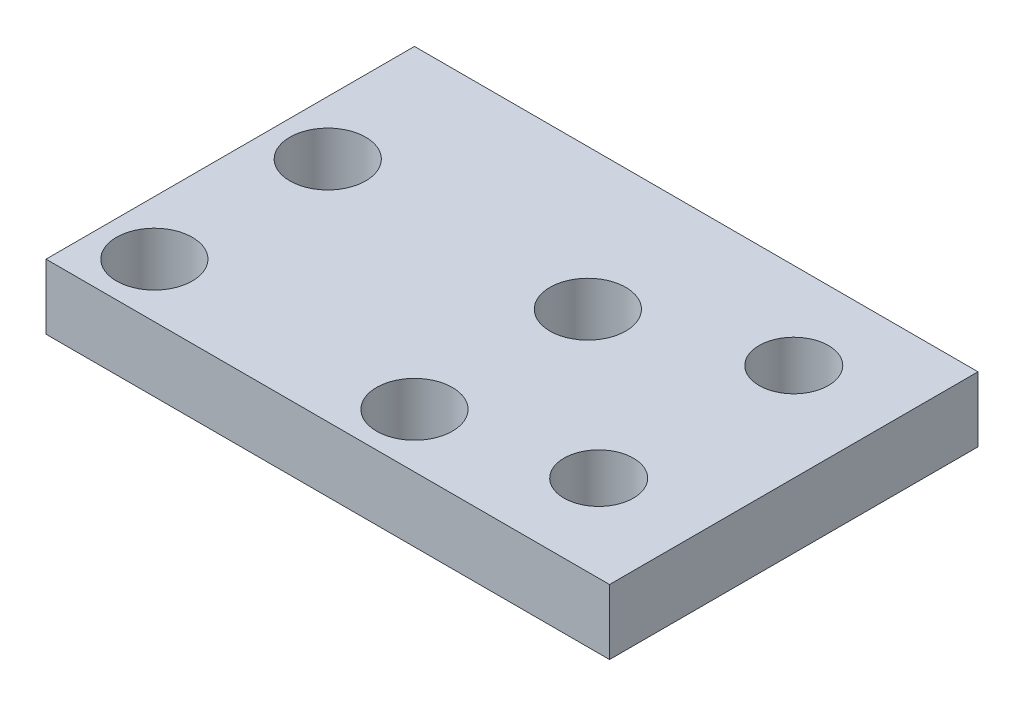
ISO-10303-21;
HEADER;
FILE_DESCRIPTION(('STEP AP214'),'2;1');
FILE_NAME('part.step','',(''),(''),'','','');
FILE_SCHEMA(('AUTOMOTIVE_DESIGN { 1 0 10303 214 1 1 1 1 }'));
ENDSEC;
DATA;
#1=APPLICATION_CONTEXT('core data for automotive mechanical design processes');
#2=APPLICATION_PROTOCOL_DEFINITION('international standard','automotive_design',2000,#1);
#3=PRODUCT_CONTEXT('',#1,'mechanical');
#4=PRODUCT('Part','Part','',(#3));
#5=PRODUCT_RELATED_PRODUCT_CATEGORY('part','',(#4));
#6=PRODUCT_DEFINITION_FORMATION('','',#4);
#7=PRODUCT_DEFINITION_CONTEXT('part definition',#1,'design');
#8=PRODUCT_DEFINITION('design','',#6,#7);
#9=PRODUCT_DEFINITION_SHAPE('','',#8);
#10=(LENGTH_UNIT() NAMED_UNIT(*) SI_UNIT(.MILLI.,.METRE.));
#11=(NAMED_UNIT(*) PLANE_ANGLE_UNIT() SI_UNIT($,.RADIAN.));
#12=(NAMED_UNIT(*) SI_UNIT($,.STERADIAN.) SOLID_ANGLE_UNIT());
#13=UNCERTAINTY_MEASURE_WITH_UNIT(LENGTH_MEASURE(1.E-05),#10,'distance_accuracy_value','');
#14=(GEOMETRIC_REPRESENTATION_CONTEXT(3) GLOBAL_UNCERTAINTY_ASSIGNED_CONTEXT((#13)) GLOBAL_UNIT_ASSIGNED_CONTEXT((#10,
#11,#12)) REPRESENTATION_CONTEXT('',''));
#15=CARTESIAN_POINT('',(0.,0.,0.));
#16=DIRECTION('',(0.,0.,1.));
#17=DIRECTION('',(1.,0.,0.));
#18=AXIS2_PLACEMENT_3D('',#15,#16,#17);
#19=CARTESIAN_POINT('',(0.,3.,0.));
#20=DIRECTION('',(0.,1.,0.));
#21=DIRECTION('',(0.,0.,1.));
#22=AXIS2_PLACEMENT_3D('',#19,#20,#21);
#23=PLANE('',#22);
#24=CARTESIAN_POINT('',(-4.5,3.,-13.));
#25=DIRECTION('',(0.,1.,0.));
#26=DIRECTION('',(0.,0.,1.));
#27=AXIS2_PLACEMENT_3D('',#24,#25,#26);
#28=CIRCLE('',#27,1.6);
#29=CARTESIAN_POINT('',(-4.5,3.,-11.4));
#30=VERTEX_POINT('',#29);
#31=EDGE_CURVE('E135',#30,#30,#28,.T.);
#32=ORIENTED_EDGE('',*,*,#31,.F.);
#33=EDGE_LOOP('',(#32));
#34=FACE_BOUND('',#33,.T.);
#35=CARTESIAN_POINT('',(-23.5,3.,-2.5));
#36=DIRECTION('',(0.,1.,0.));
#37=DIRECTION('',(0.,0.,1.));
#38=AXIS2_PLACEMENT_3D('',#35,#36,#37);
#39=CIRCLE('',#38,1.75);
#40=CARTESIAN_POINT('',(-23.5,3.,-0.749999999999999));
#41=VERTEX_POINT('',#40);
#42=EDGE_CURVE('E123',#41,#41,#39,.T.);
#43=ORIENTED_EDGE('',*,*,#42,.F.);
#44=EDGE_LOOP('',(#43));
#45=FACE_BOUND('',#44,.T.);
#46=CARTESIAN_POINT('',(-23.5,3.,-10.5));
#47=DIRECTION('',(0.,1.,0.));
#48=DIRECTION('',(0.,0.,1.));
#49=AXIS2_PLACEMENT_3D('',#46,#47,#48);
#50=CIRCLE('',#49,1.75);
#51=CARTESIAN_POINT('',(-23.5,3.,-8.75));
#52=VERTEX_POINT('',#51);
#53=EDGE_CURVE('E102',#52,#52,#50,.T.);
#54=ORIENTED_EDGE('',*,*,#53,.F.);
#55=EDGE_LOOP('',(#54));
#56=FACE_BOUND('',#55,.T.);
#57=DIRECTION('',(0.,0.,-1.));
#58=VECTOR('',#57,1.);
#59=CARTESIAN_POINT('',(0.,3.,0.));
#60=LINE('',#59,#58);
#61=CARTESIAN_POINT('',(0.,3.,0.));
#62=VERTEX_POINT('',#61);
#63=CARTESIAN_POINT('',(0.,3.,-17.));
#64=VERTEX_POINT('',#63);
#65=EDGE_CURVE('E87',#62,#64,#60,.T.);
#66=ORIENTED_EDGE('',*,*,#65,.T.);
#67=DIRECTION('',(-1.,0.,0.));
#68=VECTOR('',#67,1.);
#69=CARTESIAN_POINT('',(0.,3.,-17.));
#70=LINE('',#69,#68);
#71=CARTESIAN_POINT('',(-26.,3.,-17.));
#72=VERTEX_POINT('',#71);
#73=EDGE_CURVE('E82',#64,#72,#70,.T.);
#74=ORIENTED_EDGE('',*,*,#73,.T.);
#75=DIRECTION('',(0.,0.,1.));
#76=VECTOR('',#75,1.);
#77=CARTESIAN_POINT('',(-26.,3.,0.));
#78=LINE('',#77,#76);
#79=CARTESIAN_POINT('',(-26.,3.,0.));
#80=VERTEX_POINT('',#79);
#81=EDGE_CURVE('E85',#72,#80,#78,.T.);
#82=ORIENTED_EDGE('',*,*,#81,.T.);
#83=DIRECTION('',(1.,0.,0.));
#84=VECTOR('',#83,1.);
#85=CARTESIAN_POINT('',(0.,3.,0.));
#86=LINE('',#85,#84);
#87=EDGE_CURVE('E52',#80,#62,#86,.T.);
#88=ORIENTED_EDGE('',*,*,#87,.T.);
#89=EDGE_LOOP('',(#66,#74,#82,#88));
#90=FACE_BOUND('',#89,.T.);
#91=CARTESIAN_POINT('',(-11.5,3.,-10.5));
#92=DIRECTION('',(0.,1.,0.));
#93=DIRECTION('',(0.,0.,1.));
#94=AXIS2_PLACEMENT_3D('',#91,#92,#93);
#95=CIRCLE('',#94,1.75);
#96=CARTESIAN_POINT('',(-11.5,3.,-8.75));
#97=VERTEX_POINT('',#96);
#98=EDGE_CURVE('E117',#97,#97,#95,.T.);
#99=ORIENTED_EDGE('',*,*,#98,.F.);
#100=EDGE_LOOP('',(#99));
#101=FACE_BOUND('',#100,.T.);
#102=CARTESIAN_POINT('',(-11.5,3.,-2.5));
#103=DIRECTION('',(0.,1.,0.));
#104=DIRECTION('',(0.,0.,1.));
#105=AXIS2_PLACEMENT_3D('',#102,#103,#104);
#106=CIRCLE('',#105,1.75);
#107=CARTESIAN_POINT('',(-11.5,3.,-0.749999999999997));
#108=VERTEX_POINT('',#107);
#109=EDGE_CURVE('E129',#108,#108,#106,.T.);
#110=ORIENTED_EDGE('',*,*,#109,.F.);
#111=EDGE_LOOP('',(#110));
#112=FACE_BOUND('',#111,.T.);
#113=CARTESIAN_POINT('',(-4.5,3.,-4.));
#114=DIRECTION('',(0.,1.,0.));
#115=DIRECTION('',(0.,0.,1.));
#116=AXIS2_PLACEMENT_3D('',#113,#114,#115);
#117=CIRCLE('',#116,1.6);
#118=CARTESIAN_POINT('',(-4.5,3.,-2.4));
#119=VERTEX_POINT('',#118);
#120=EDGE_CURVE('E141',#119,#119,#117,.T.);
#121=ORIENTED_EDGE('',*,*,#120,.F.);
#122=EDGE_LOOP('',(#121));
#123=FACE_BOUND('',#122,.T.);
#124=ADVANCED_FACE('F35',(#34,#45,#56,#90,#101,#112,#123),#23,.T.);
#125=CARTESIAN_POINT('',(0.,0.,0.));
#126=DIRECTION('',(0.,1.,0.));
#127=DIRECTION('',(0.,0.,1.));
#128=AXIS2_PLACEMENT_3D('',#125,#126,#127);
#129=PLANE('',#128);
#130=DIRECTION('',(0.,0.,-1.));
#131=VECTOR('',#130,1.);
#132=CARTESIAN_POINT('',(0.,0.,0.));
#133=LINE('',#132,#131);
#134=CARTESIAN_POINT('',(0.,0.,0.));
#135=VERTEX_POINT('',#134);
#136=CARTESIAN_POINT('',(0.,0.,-17.));
#137=VERTEX_POINT('',#136);
#138=EDGE_CURVE('E99',#135,#137,#133,.T.);
#139=ORIENTED_EDGE('',*,*,#138,.F.);
#140=DIRECTION('',(1.,0.,0.));
#141=VECTOR('',#140,1.);
#142=CARTESIAN_POINT('',(0.,0.,0.));
#143=LINE('',#142,#141);
#144=CARTESIAN_POINT('',(-26.,0.,0.));
#145=VERTEX_POINT('',#144);
#146=EDGE_CURVE('E75',#145,#135,#143,.T.);
#147=ORIENTED_EDGE('',*,*,#146,.F.);
#148=DIRECTION('',(0.,0.,1.));
#149=VECTOR('',#148,1.);
#150=CARTESIAN_POINT('',(-26.,0.,0.));
#151=LINE('',#150,#149);
#152=CARTESIAN_POINT('',(-26.,0.,-17.));
#153=VERTEX_POINT('',#152);
#154=EDGE_CURVE('E69',#153,#145,#151,.T.);
#155=ORIENTED_EDGE('',*,*,#154,.F.);
#156=DIRECTION('',(-1.,0.,0.));
#157=VECTOR('',#156,1.);
#158=CARTESIAN_POINT('',(0.,0.,-17.));
#159=LINE('',#158,#157);
#160=EDGE_CURVE('E91',#137,#153,#159,.T.);
#161=ORIENTED_EDGE('',*,*,#160,.F.);
#162=EDGE_LOOP('',(#139,#147,#155,#161));
#163=FACE_BOUND('',#162,.T.);
#164=CARTESIAN_POINT('',(-23.5,0.,-10.5));
#165=DIRECTION('',(0.,1.,0.));
#166=DIRECTION('',(0.,0.,1.));
#167=AXIS2_PLACEMENT_3D('',#164,#165,#166);
#168=CIRCLE('',#167,1.75);
#169=CARTESIAN_POINT('',(-23.5,0.,-8.75));
#170=VERTEX_POINT('',#169);
#171=EDGE_CURVE('E114',#170,#170,#168,.T.);
#172=ORIENTED_EDGE('',*,*,#171,.T.);
#173=EDGE_LOOP('',(#172));
#174=FACE_BOUND('',#173,.T.);
#175=CARTESIAN_POINT('',(-11.5,0.,-10.5));
#176=DIRECTION('',(0.,1.,0.));
#177=DIRECTION('',(0.,0.,1.));
#178=AXIS2_PLACEMENT_3D('',#175,#176,#177);
#179=CIRCLE('',#178,1.75);
#180=CARTESIAN_POINT('',(-11.5,0.,-8.75));
#181=VERTEX_POINT('',#180);
#182=EDGE_CURVE('E120',#181,#181,#179,.T.);
#183=ORIENTED_EDGE('',*,*,#182,.T.);
#184=EDGE_LOOP('',(#183));
#185=FACE_BOUND('',#184,.T.);
#186=CARTESIAN_POINT('',(-23.5,0.,-2.5));
#187=DIRECTION('',(0.,1.,0.));
#188=DIRECTION('',(0.,0.,1.));
#189=AXIS2_PLACEMENT_3D('',#186,#187,#188);
#190=CIRCLE('',#189,1.75);
#191=CARTESIAN_POINT('',(-23.5,0.,-0.749999999999999));
#192=VERTEX_POINT('',#191);
#193=EDGE_CURVE('E126',#192,#192,#190,.T.);
#194=ORIENTED_EDGE('',*,*,#193,.T.);
#195=EDGE_LOOP('',(#194));
#196=FACE_BOUND('',#195,.T.);
#197=CARTESIAN_POINT('',(-11.5,0.,-2.5));
#198=DIRECTION('',(0.,1.,0.));
#199=DIRECTION('',(0.,0.,1.));
#200=AXIS2_PLACEMENT_3D('',#197,#198,#199);
#201=CIRCLE('',#200,1.75);
#202=CARTESIAN_POINT('',(-11.5,0.,-0.749999999999997));
#203=VERTEX_POINT('',#202);
#204=EDGE_CURVE('E132',#203,#203,#201,.T.);
#205=ORIENTED_EDGE('',*,*,#204,.T.);
#206=EDGE_LOOP('',(#205));
#207=FACE_BOUND('',#206,.T.);
#208=CARTESIAN_POINT('',(-4.5,0.,-13.));
#209=DIRECTION('',(0.,1.,0.));
#210=DIRECTION('',(0.,0.,1.));
#211=AXIS2_PLACEMENT_3D('',#208,#209,#210);
#212=CIRCLE('',#211,1.6);
#213=CARTESIAN_POINT('',(-4.5,0.,-11.4));
#214=VERTEX_POINT('',#213);
#215=EDGE_CURVE('E138',#214,#214,#212,.T.);
#216=ORIENTED_EDGE('',*,*,#215,.T.);
#217=EDGE_LOOP('',(#216));
#218=FACE_BOUND('',#217,.T.);
#219=CARTESIAN_POINT('',(-4.5,0.,-4.));
#220=DIRECTION('',(0.,1.,0.));
#221=DIRECTION('',(0.,0.,1.));
#222=AXIS2_PLACEMENT_3D('',#219,#220,#221);
#223=CIRCLE('',#222,1.6);
#224=CARTESIAN_POINT('',(-4.5,0.,-2.4));
#225=VERTEX_POINT('',#224);
#226=EDGE_CURVE('E144',#225,#225,#223,.T.);
#227=ORIENTED_EDGE('',*,*,#226,.T.);
#228=EDGE_LOOP('',(#227));
#229=FACE_BOUND('',#228,.T.);
#230=ADVANCED_FACE('F110',(#163,#174,#185,#196,#207,#218,#229),#129,.F.);
#231=CARTESIAN_POINT('',(0.,3.,0.));
#232=DIRECTION('',(-1.,0.,0.));
#233=DIRECTION('',(0.,0.,1.));
#234=AXIS2_PLACEMENT_3D('',#231,#232,#233);
#235=PLANE('',#234);
#236=ORIENTED_EDGE('',*,*,#138,.T.);
#237=DIRECTION('',(0.,-1.,0.));
#238=VECTOR('',#237,1.);
#239=CARTESIAN_POINT('',(0.,3.,-17.));
#240=LINE('',#239,#238);
#241=EDGE_CURVE('E11',#64,#137,#240,.T.);
#242=ORIENTED_EDGE('',*,*,#241,.F.);
#243=ORIENTED_EDGE('',*,*,#65,.F.);
#244=DIRECTION('',(0.,-1.,0.));
#245=VECTOR('',#244,1.);
#246=CARTESIAN_POINT('',(0.,3.,0.));
#247=LINE('',#246,#245);
#248=EDGE_CURVE('E95',#62,#135,#247,.T.);
#249=ORIENTED_EDGE('',*,*,#248,.T.);
#250=EDGE_LOOP('',(#236,#242,#243,#249));
#251=FACE_BOUND('',#250,.T.);
#252=ADVANCED_FACE('F37',(#251),#235,.F.);
#253=CARTESIAN_POINT('',(0.,3.,-17.));
#254=DIRECTION('',(0.,0.,1.));
#255=DIRECTION('',(1.,0.,0.));
#256=AXIS2_PLACEMENT_3D('',#253,#254,#255);
#257=PLANE('',#256);
#258=ORIENTED_EDGE('',*,*,#160,.T.);
#259=DIRECTION('',(0.,-1.,0.));
#260=VECTOR('',#259,1.);
#261=CARTESIAN_POINT('',(-26.,3.,-17.));
#262=LINE('',#261,#260);
#263=EDGE_CURVE('E44',#72,#153,#262,.T.);
#264=ORIENTED_EDGE('',*,*,#263,.F.);
#265=ORIENTED_EDGE('',*,*,#73,.F.);
#266=ORIENTED_EDGE('',*,*,#241,.T.);
#267=EDGE_LOOP('',(#258,#264,#265,#266));
#268=FACE_BOUND('',#267,.T.);
#269=ADVANCED_FACE('F90',(#268),#257,.F.);
#270=CARTESIAN_POINT('',(-26.,3.,0.));
#271=DIRECTION('',(1.,0.,0.));
#272=DIRECTION('',(0.,0.,-1.));
#273=AXIS2_PLACEMENT_3D('',#270,#271,#272);
#274=PLANE('',#273);
#275=ORIENTED_EDGE('',*,*,#154,.T.);
#276=DIRECTION('',(0.,-1.,0.));
#277=VECTOR('',#276,1.);
#278=CARTESIAN_POINT('',(-26.,3.,0.));
#279=LINE('',#278,#277);
#280=EDGE_CURVE('E92',#80,#145,#279,.T.);
#281=ORIENTED_EDGE('',*,*,#280,.F.);
#282=ORIENTED_EDGE('',*,*,#81,.F.);
#283=ORIENTED_EDGE('',*,*,#263,.T.);
#284=EDGE_LOOP('',(#275,#281,#282,#283));
#285=FACE_BOUND('',#284,.T.);
#286=ADVANCED_FACE('F93',(#285),#274,.F.);
#287=CARTESIAN_POINT('',(0.,3.,0.));
#288=DIRECTION('',(0.,0.,-1.));
#289=DIRECTION('',(-1.,0.,0.));
#290=AXIS2_PLACEMENT_3D('',#287,#288,#289);
#291=PLANE('',#290);
#292=ORIENTED_EDGE('',*,*,#146,.T.);
#293=ORIENTED_EDGE('',*,*,#248,.F.);
#294=ORIENTED_EDGE('',*,*,#87,.F.);
#295=ORIENTED_EDGE('',*,*,#280,.T.);
#296=EDGE_LOOP('',(#292,#293,#294,#295));
#297=FACE_BOUND('',#296,.T.);
#298=ADVANCED_FACE('F107',(#297),#291,.F.);
#299=CARTESIAN_POINT('',(-23.5,3.,-10.5));
#300=DIRECTION('',(0.,-1.,0.));
#301=DIRECTION('',(0.,0.,-1.));
#302=AXIS2_PLACEMENT_3D('',#299,#300,#301);
#303=CYLINDRICAL_SURFACE('',#302,1.75);
#304=ORIENTED_EDGE('',*,*,#53,.T.);
#305=EDGE_LOOP('',(#304));
#306=FACE_BOUND('',#305,.T.);
#307=ORIENTED_EDGE('',*,*,#171,.F.);
#308=EDGE_LOOP('',(#307));
#309=FACE_BOUND('',#308,.T.);
#310=ADVANCED_FACE('F163',(#306,#309),#303,.F.);
#311=CARTESIAN_POINT('',(-11.5,3.,-10.5));
#312=DIRECTION('',(0.,-1.,0.));
#313=DIRECTION('',(0.,0.,-1.));
#314=AXIS2_PLACEMENT_3D('',#311,#312,#313);
#315=CYLINDRICAL_SURFACE('',#314,1.75);
#316=ORIENTED_EDGE('',*,*,#98,.T.);
#317=EDGE_LOOP('',(#316));
#318=FACE_BOUND('',#317,.T.);
#319=ORIENTED_EDGE('',*,*,#182,.F.);
#320=EDGE_LOOP('',(#319));
#321=FACE_BOUND('',#320,.T.);
#322=ADVANCED_FACE('F209',(#318,#321),#315,.F.);
#323=CARTESIAN_POINT('',(-23.5,3.,-2.5));
#324=DIRECTION('',(0.,-1.,0.));
#325=DIRECTION('',(0.,0.,-1.));
#326=AXIS2_PLACEMENT_3D('',#323,#324,#325);
#327=CYLINDRICAL_SURFACE('',#326,1.75);
#328=ORIENTED_EDGE('',*,*,#42,.T.);
#329=EDGE_LOOP('',(#328));
#330=FACE_BOUND('',#329,.T.);
#331=ORIENTED_EDGE('',*,*,#193,.F.);
#332=EDGE_LOOP('',(#331));
#333=FACE_BOUND('',#332,.T.);
#334=ADVANCED_FACE('F217',(#330,#333),#327,.F.);
#335=CARTESIAN_POINT('',(-11.5,3.,-2.5));
#336=DIRECTION('',(0.,-1.,0.));
#337=DIRECTION('',(0.,0.,-1.));
#338=AXIS2_PLACEMENT_3D('',#335,#336,#337);
#339=CYLINDRICAL_SURFACE('',#338,1.75);
#340=ORIENTED_EDGE('',*,*,#109,.T.);
#341=EDGE_LOOP('',(#340));
#342=FACE_BOUND('',#341,.T.);
#343=ORIENTED_EDGE('',*,*,#204,.F.);
#344=EDGE_LOOP('',(#343));
#345=FACE_BOUND('',#344,.T.);
#346=ADVANCED_FACE('F225',(#342,#345),#339,.F.);
#347=CARTESIAN_POINT('',(-4.5,3.,-13.));
#348=DIRECTION('',(0.,-1.,0.));
#349=DIRECTION('',(0.,0.,-1.));
#350=AXIS2_PLACEMENT_3D('',#347,#348,#349);
#351=CYLINDRICAL_SURFACE('',#350,1.6);
#352=ORIENTED_EDGE('',*,*,#31,.T.);
#353=EDGE_LOOP('',(#352));
#354=FACE_BOUND('',#353,.T.);
#355=ORIENTED_EDGE('',*,*,#215,.F.);
#356=EDGE_LOOP('',(#355));
#357=FACE_BOUND('',#356,.T.);
#358=ADVANCED_FACE('F234',(#354,#357),#351,.F.);
#359=CARTESIAN_POINT('',(-4.5,3.,-4.));
#360=DIRECTION('',(0.,-1.,0.));
#361=DIRECTION('',(0.,0.,-1.));
#362=AXIS2_PLACEMENT_3D('',#359,#360,#361);
#363=CYLINDRICAL_SURFACE('',#362,1.6);
#364=ORIENTED_EDGE('',*,*,#120,.T.);
#365=EDGE_LOOP('',(#364));
#366=FACE_BOUND('',#365,.T.);
#367=ORIENTED_EDGE('',*,*,#226,.F.);
#368=EDGE_LOOP('',(#367));
#369=FACE_BOUND('',#368,.T.);
#370=ADVANCED_FACE('F150',(#366,#369),#363,.F.);
#371=CLOSED_SHELL('',(#124,#230,#252,#269,#286,#298,#310,#322,#334,#346,#358,#370));
#372=MANIFOLD_SOLID_BREP('B2',#371);
#373=ADVANCED_BREP_SHAPE_REPRESENTATION('',(#18,#372),#14);
#374=SHAPE_DEFINITION_REPRESENTATION(#9,#373);
ENDSEC;
END-ISO-10303-21;
